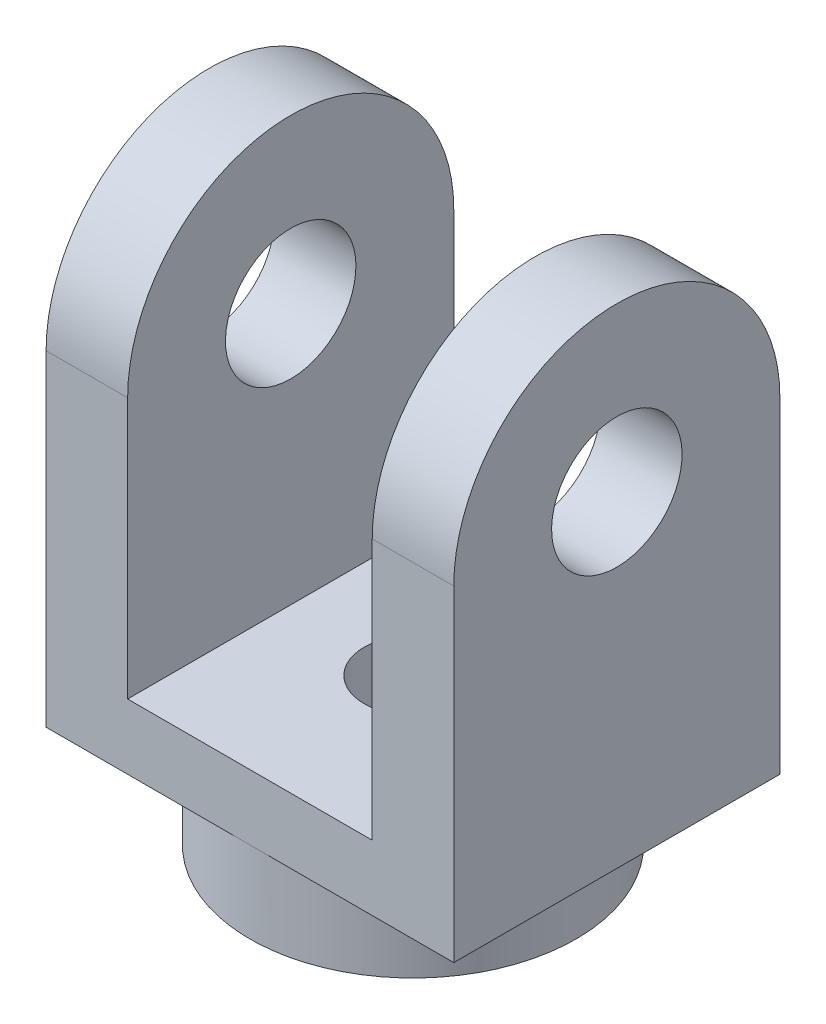
ISO-10303-21;
HEADER;
FILE_DESCRIPTION(('STEP AP214'),'2;1');
FILE_NAME('part.step','',(''),(''),'','','');
FILE_SCHEMA(('AUTOMOTIVE_DESIGN { 1 0 10303 214 1 1 1 1 }'));
ENDSEC;
DATA;
#1=APPLICATION_CONTEXT('core data for automotive mechanical design processes');
#2=APPLICATION_PROTOCOL_DEFINITION('international standard','automotive_design',2000,#1);
#3=PRODUCT_CONTEXT('',#1,'mechanical');
#4=PRODUCT('Part','Part','',(#3));
#5=PRODUCT_RELATED_PRODUCT_CATEGORY('part','',(#4));
#6=PRODUCT_DEFINITION_FORMATION('','',#4);
#7=PRODUCT_DEFINITION_CONTEXT('part definition',#1,'design');
#8=PRODUCT_DEFINITION('design','',#6,#7);
#9=PRODUCT_DEFINITION_SHAPE('','',#8);
#10=(LENGTH_UNIT() NAMED_UNIT(*) SI_UNIT(.MILLI.,.METRE.));
#11=(NAMED_UNIT(*) PLANE_ANGLE_UNIT() SI_UNIT($,.RADIAN.));
#12=(NAMED_UNIT(*) SI_UNIT($,.STERADIAN.) SOLID_ANGLE_UNIT());
#13=UNCERTAINTY_MEASURE_WITH_UNIT(LENGTH_MEASURE(1.E-05),#10,'distance_accuracy_value','');
#14=(GEOMETRIC_REPRESENTATION_CONTEXT(3) GLOBAL_UNCERTAINTY_ASSIGNED_CONTEXT((#13)) GLOBAL_UNIT_ASSIGNED_CONTEXT((#10,
#11,#12)) REPRESENTATION_CONTEXT('',''));
#15=CARTESIAN_POINT('',(0.,0.,0.));
#16=DIRECTION('',(0.,0.,1.));
#17=DIRECTION('',(1.,0.,0.));
#18=AXIS2_PLACEMENT_3D('',#15,#16,#17);
#19=CARTESIAN_POINT('',(-62.5,25.,50.));
#20=DIRECTION('',(0.,1.,0.));
#21=DIRECTION('',(0.,0.,1.));
#22=AXIS2_PLACEMENT_3D('',#19,#20,#21);
#23=PLANE('',#22);
#24=CARTESIAN_POINT('',(0.,25.,0.));
#25=DIRECTION('',(0.,-1.,0.));
#26=DIRECTION('',(0.,0.,-1.));
#27=AXIS2_PLACEMENT_3D('',#24,#25,#26);
#28=CIRCLE('',#27,50.);
#29=CARTESIAN_POINT('',(0.,25.,-50.));
#30=VERTEX_POINT('',#29);
#31=CARTESIAN_POINT('',(0.,25.,50.));
#32=VERTEX_POINT('',#31);
#33=EDGE_CURVE('E46',#30,#32,#28,.T.);
#34=ORIENTED_EDGE('',*,*,#33,.F.);
#35=DIRECTION('',(1.,0.,0.));
#36=VECTOR('',#35,1.);
#37=CARTESIAN_POINT('',(-62.5,25.,-50.));
#38=LINE('',#37,#36);
#39=CARTESIAN_POINT('',(62.5,25.,-50.));
#40=VERTEX_POINT('',#39);
#41=EDGE_CURVE('E145',#30,#40,#38,.T.);
#42=ORIENTED_EDGE('',*,*,#41,.T.);
#43=DIRECTION('',(0.,0.,-1.));
#44=VECTOR('',#43,1.);
#45=CARTESIAN_POINT('',(62.5,25.,50.));
#46=LINE('',#45,#44);
#47=CARTESIAN_POINT('',(62.5,25.,50.));
#48=VERTEX_POINT('',#47);
#49=EDGE_CURVE('E131',#48,#40,#46,.T.);
#50=ORIENTED_EDGE('',*,*,#49,.F.);
#51=DIRECTION('',(1.,0.,0.));
#52=VECTOR('',#51,1.);
#53=CARTESIAN_POINT('',(-62.5,25.,50.));
#54=LINE('',#53,#52);
#55=EDGE_CURVE('E179',#32,#48,#54,.T.);
#56=ORIENTED_EDGE('',*,*,#55,.F.);
#57=EDGE_LOOP('',(#34,#42,#50,#56));
#58=FACE_BOUND('',#57,.T.);
#59=ADVANCED_FACE('F36',(#58),#23,.F.);
#60=CARTESIAN_POINT('',(0.,25.,0.));
#61=DIRECTION('',(0.,1.,0.));
#62=DIRECTION('',(-1.,0.,0.));
#63=AXIS2_PLACEMENT_3D('',#60,#61,#62);
#64=CIRCLE('',#63,15.);
#65=CARTESIAN_POINT('',(-15.,25.,0.));
#66=VERTEX_POINT('',#65);
#67=EDGE_CURVE('E248',#66,#66,#64,.T.);
#68=ORIENTED_EDGE('',*,*,#67,.T.);
#69=EDGE_LOOP('',(#68));
#70=FACE_BOUND('',#69,.T.);
#71=CARTESIAN_POINT('',(0.,25.,0.));
#72=DIRECTION('',(0.,-1.,0.));
#73=DIRECTION('',(0.,0.,-1.));
#74=AXIS2_PLACEMENT_3D('',#71,#72,#73);
#75=CIRCLE('',#74,37.5);
#76=CARTESIAN_POINT('',(0.,25.,-37.5));
#77=VERTEX_POINT('',#76);
#78=EDGE_CURVE('E257',#77,#77,#75,.T.);
#79=ORIENTED_EDGE('',*,*,#78,.T.);
#80=EDGE_LOOP('',(#79));
#81=FACE_BOUND('',#80,.T.);
#82=ADVANCED_FACE('F201',(#70,#81),#23,.F.);
#83=CARTESIAN_POINT('',(-62.5,125.,50.));
#84=DIRECTION('',(1.,0.,0.));
#85=DIRECTION('',(0.,1.,0.));
#86=AXIS2_PLACEMENT_3D('',#83,#84,#85);
#87=PLANE('',#86);
#88=CARTESIAN_POINT('',(-62.5,125.,0.));
#89=DIRECTION('',(-1.,0.,0.));
#90=DIRECTION('',(0.,-1.,0.));
#91=AXIS2_PLACEMENT_3D('',#88,#89,#90);
#92=CIRCLE('',#91,20.);
#93=CARTESIAN_POINT('',(-62.5,105.,0.));
#94=VERTEX_POINT('',#93);
#95=EDGE_CURVE('E219',#94,#94,#92,.T.);
#96=ORIENTED_EDGE('',*,*,#95,.F.);
#97=EDGE_LOOP('',(#96));
#98=FACE_BOUND('',#97,.T.);
#99=DIRECTION('',(0.,-1.,0.));
#100=VECTOR('',#99,1.);
#101=CARTESIAN_POINT('',(-62.5,125.,50.));
#102=LINE('',#101,#100);
#103=CARTESIAN_POINT('',(-62.5,125.,50.));
#104=VERTEX_POINT('',#103);
#105=CARTESIAN_POINT('',(-62.5,25.,50.));
#106=VERTEX_POINT('',#105);
#107=EDGE_CURVE('E97',#104,#106,#102,.T.);
#108=ORIENTED_EDGE('',*,*,#107,.F.);
#109=CARTESIAN_POINT('',(-62.5,125.,0.));
#110=DIRECTION('',(-1.,0.,0.));
#111=DIRECTION('',(0.,-1.,0.));
#112=AXIS2_PLACEMENT_3D('',#109,#110,#111);
#113=CIRCLE('',#112,50.);
#114=CARTESIAN_POINT('',(-62.5,125.,-50.));
#115=VERTEX_POINT('',#114);
#116=EDGE_CURVE('E225',#104,#115,#113,.T.);
#117=ORIENTED_EDGE('',*,*,#116,.T.);
#118=DIRECTION('',(0.,-1.,0.));
#119=VECTOR('',#118,1.);
#120=CARTESIAN_POINT('',(-62.5,125.,-50.));
#121=LINE('',#120,#119);
#122=CARTESIAN_POINT('',(-62.5,25.,-50.));
#123=VERTEX_POINT('',#122);
#124=EDGE_CURVE('E142',#115,#123,#121,.T.);
#125=ORIENTED_EDGE('',*,*,#124,.T.);
#126=DIRECTION('',(0.,0.,-1.));
#127=VECTOR('',#126,1.);
#128=CARTESIAN_POINT('',(-62.5,25.,50.));
#129=LINE('',#128,#127);
#130=EDGE_CURVE('E40',#106,#123,#129,.T.);
#131=ORIENTED_EDGE('',*,*,#130,.F.);
#132=EDGE_LOOP('',(#108,#117,#125,#131));
#133=FACE_BOUND('',#132,.T.);
#134=ADVANCED_FACE('F38',(#98,#133),#87,.F.);
#135=EDGE_CURVE('E11',#32,#30,#28,.T.);
#136=ORIENTED_EDGE('',*,*,#135,.F.);
#137=EDGE_CURVE('E169',#106,#32,#54,.T.);
#138=ORIENTED_EDGE('',*,*,#137,.F.);
#139=ORIENTED_EDGE('',*,*,#130,.T.);
#140=EDGE_CURVE('E146',#123,#30,#38,.T.);
#141=ORIENTED_EDGE('',*,*,#140,.T.);
#142=EDGE_LOOP('',(#136,#138,#139,#141));
#143=FACE_BOUND('',#142,.T.);
#144=ADVANCED_FACE('F165',(#143),#23,.F.);
#145=CARTESIAN_POINT('',(62.5,25.,50.));
#146=DIRECTION('',(-1.,0.,0.));
#147=DIRECTION('',(0.,-1.,0.));
#148=AXIS2_PLACEMENT_3D('',#145,#146,#147);
#149=PLANE('',#148);
#150=CARTESIAN_POINT('',(62.5,125.,0.));
#151=DIRECTION('',(-1.,0.,0.));
#152=DIRECTION('',(0.,-1.,0.));
#153=AXIS2_PLACEMENT_3D('',#150,#151,#152);
#154=CIRCLE('',#153,20.);
#155=CARTESIAN_POINT('',(62.5,105.,0.));
#156=VERTEX_POINT('',#155);
#157=EDGE_CURVE('E244',#156,#156,#154,.T.);
#158=ORIENTED_EDGE('',*,*,#157,.T.);
#159=EDGE_LOOP('',(#158));
#160=FACE_BOUND('',#159,.T.);
#161=DIRECTION('',(0.,1.,0.));
#162=VECTOR('',#161,1.);
#163=CARTESIAN_POINT('',(62.5,25.,-50.));
#164=LINE('',#163,#162);
#165=CARTESIAN_POINT('',(62.5,125.,-50.));
#166=VERTEX_POINT('',#165);
#167=EDGE_CURVE('E148',#40,#166,#164,.T.);
#168=ORIENTED_EDGE('',*,*,#167,.T.);
#169=CARTESIAN_POINT('',(62.5,125.,0.));
#170=DIRECTION('',(-1.,0.,0.));
#171=DIRECTION('',(0.,-1.,0.));
#172=AXIS2_PLACEMENT_3D('',#169,#170,#171);
#173=CIRCLE('',#172,50.);
#174=CARTESIAN_POINT('',(62.5,125.,50.));
#175=VERTEX_POINT('',#174);
#176=EDGE_CURVE('E227',#175,#166,#173,.T.);
#177=ORIENTED_EDGE('',*,*,#176,.F.);
#178=DIRECTION('',(0.,1.,0.));
#179=VECTOR('',#178,1.);
#180=CARTESIAN_POINT('',(62.5,25.,50.));
#181=LINE('',#180,#179);
#182=EDGE_CURVE('E237',#48,#175,#181,.T.);
#183=ORIENTED_EDGE('',*,*,#182,.F.);
#184=ORIENTED_EDGE('',*,*,#49,.T.);
#185=EDGE_LOOP('',(#168,#177,#183,#184));
#186=FACE_BOUND('',#185,.T.);
#187=ADVANCED_FACE('F208',(#160,#186),#149,.F.);
#188=CARTESIAN_POINT('',(37.5,125.,50.));
#189=DIRECTION('',(1.,0.,0.));
#190=DIRECTION('',(0.,1.,0.));
#191=AXIS2_PLACEMENT_3D('',#188,#189,#190);
#192=PLANE('',#191);
#193=CARTESIAN_POINT('',(37.5,125.,0.));
#194=DIRECTION('',(-1.,0.,0.));
#195=DIRECTION('',(0.,-1.,0.));
#196=AXIS2_PLACEMENT_3D('',#193,#194,#195);
#197=CIRCLE('',#196,20.);
#198=CARTESIAN_POINT('',(37.5,105.,0.));
#199=VERTEX_POINT('',#198);
#200=EDGE_CURVE('E242',#199,#199,#197,.T.);
#201=ORIENTED_EDGE('',*,*,#200,.F.);
#202=EDGE_LOOP('',(#201));
#203=FACE_BOUND('',#202,.T.);
#204=DIRECTION('',(0.,-1.,0.));
#205=VECTOR('',#204,1.);
#206=CARTESIAN_POINT('',(37.5,125.,50.));
#207=LINE('',#206,#205);
#208=CARTESIAN_POINT('',(37.5,125.,50.));
#209=VERTEX_POINT('',#208);
#210=CARTESIAN_POINT('',(37.5,45.,50.));
#211=VERTEX_POINT('',#210);
#212=EDGE_CURVE('E112',#209,#211,#207,.T.);
#213=ORIENTED_EDGE('',*,*,#212,.F.);
#214=CARTESIAN_POINT('',(37.5,125.,0.));
#215=DIRECTION('',(-1.,0.,0.));
#216=DIRECTION('',(0.,-1.,0.));
#217=AXIS2_PLACEMENT_3D('',#214,#215,#216);
#218=CIRCLE('',#217,50.);
#219=CARTESIAN_POINT('',(37.5,125.,-50.));
#220=VERTEX_POINT('',#219);
#221=EDGE_CURVE('E222',#209,#220,#218,.T.);
#222=ORIENTED_EDGE('',*,*,#221,.T.);
#223=DIRECTION('',(0.,-1.,0.));
#224=VECTOR('',#223,1.);
#225=CARTESIAN_POINT('',(37.5,125.,-50.));
#226=LINE('',#225,#224);
#227=CARTESIAN_POINT('',(37.5,45.,-50.));
#228=VERTEX_POINT('',#227);
#229=EDGE_CURVE('E128',#220,#228,#226,.T.);
#230=ORIENTED_EDGE('',*,*,#229,.T.);
#231=DIRECTION('',(0.,0.,-1.));
#232=VECTOR('',#231,1.);
#233=CARTESIAN_POINT('',(37.5,45.,50.));
#234=LINE('',#233,#232);
#235=EDGE_CURVE('E125',#211,#228,#234,.T.);
#236=ORIENTED_EDGE('',*,*,#235,.F.);
#237=EDGE_LOOP('',(#213,#222,#230,#236));
#238=FACE_BOUND('',#237,.T.);
#239=ADVANCED_FACE('F126',(#203,#238),#192,.F.);
#240=CARTESIAN_POINT('',(37.5,45.,50.));
#241=DIRECTION('',(0.,-1.,0.));
#242=DIRECTION('',(1.,0.,0.));
#243=AXIS2_PLACEMENT_3D('',#240,#241,#242);
#244=PLANE('',#243);
#245=CARTESIAN_POINT('',(0.,45.,0.));
#246=DIRECTION('',(0.,1.,0.));
#247=DIRECTION('',(-1.,0.,0.));
#248=AXIS2_PLACEMENT_3D('',#245,#246,#247);
#249=CIRCLE('',#248,15.);
#250=CARTESIAN_POINT('',(-15.,45.,0.));
#251=VERTEX_POINT('',#250);
#252=EDGE_CURVE('E250',#251,#251,#249,.T.);
#253=ORIENTED_EDGE('',*,*,#252,.F.);
#254=EDGE_LOOP('',(#253));
#255=FACE_BOUND('',#254,.T.);
#256=DIRECTION('',(-1.,0.,0.));
#257=VECTOR('',#256,1.);
#258=CARTESIAN_POINT('',(37.5,45.,-50.));
#259=LINE('',#258,#257);
#260=CARTESIAN_POINT('',(-37.5,45.,-50.));
#261=VERTEX_POINT('',#260);
#262=EDGE_CURVE('E154',#228,#261,#259,.T.);
#263=ORIENTED_EDGE('',*,*,#262,.T.);
#264=DIRECTION('',(0.,0.,-1.));
#265=VECTOR('',#264,1.);
#266=CARTESIAN_POINT('',(-37.5,45.,50.));
#267=LINE('',#266,#265);
#268=CARTESIAN_POINT('',(-37.5,45.,50.));
#269=VERTEX_POINT('',#268);
#270=EDGE_CURVE('E132',#269,#261,#267,.T.);
#271=ORIENTED_EDGE('',*,*,#270,.F.);
#272=DIRECTION('',(-1.,0.,0.));
#273=VECTOR('',#272,1.);
#274=CARTESIAN_POINT('',(37.5,45.,50.));
#275=LINE('',#274,#273);
#276=EDGE_CURVE('E116',#211,#269,#275,.T.);
#277=ORIENTED_EDGE('',*,*,#276,.F.);
#278=ORIENTED_EDGE('',*,*,#235,.T.);
#279=EDGE_LOOP('',(#263,#271,#277,#278));
#280=FACE_BOUND('',#279,.T.);
#281=ADVANCED_FACE('F134',(#255,#280),#244,.F.);
#282=CARTESIAN_POINT('',(-37.5,45.,50.));
#283=DIRECTION('',(-1.,0.,0.));
#284=DIRECTION('',(0.,0.,1.));
#285=AXIS2_PLACEMENT_3D('',#282,#283,#284);
#286=PLANE('',#285);
#287=CARTESIAN_POINT('',(-37.5,125.,0.));
#288=DIRECTION('',(-1.,0.,0.));
#289=DIRECTION('',(0.,-1.,0.));
#290=AXIS2_PLACEMENT_3D('',#287,#288,#289);
#291=CIRCLE('',#290,20.);
#292=CARTESIAN_POINT('',(-37.5,105.,0.));
#293=VERTEX_POINT('',#292);
#294=EDGE_CURVE('E221',#293,#293,#291,.T.);
#295=ORIENTED_EDGE('',*,*,#294,.T.);
#296=EDGE_LOOP('',(#295));
#297=FACE_BOUND('',#296,.T.);
#298=DIRECTION('',(0.,1.,0.));
#299=VECTOR('',#298,1.);
#300=CARTESIAN_POINT('',(-37.5,45.,-50.));
#301=LINE('',#300,#299);
#302=CARTESIAN_POINT('',(-37.5,125.,-50.));
#303=VERTEX_POINT('',#302);
#304=EDGE_CURVE('E88',#261,#303,#301,.T.);
#305=ORIENTED_EDGE('',*,*,#304,.T.);
#306=CARTESIAN_POINT('',(-37.5,125.,0.));
#307=DIRECTION('',(-1.,0.,0.));
#308=DIRECTION('',(0.,-1.,0.));
#309=AXIS2_PLACEMENT_3D('',#306,#307,#308);
#310=CIRCLE('',#309,50.);
#311=CARTESIAN_POINT('',(-37.5,125.,50.));
#312=VERTEX_POINT('',#311);
#313=EDGE_CURVE('E143',#312,#303,#310,.T.);
#314=ORIENTED_EDGE('',*,*,#313,.F.);
#315=DIRECTION('',(0.,1.,0.));
#316=VECTOR('',#315,1.);
#317=CARTESIAN_POINT('',(-37.5,45.,50.));
#318=LINE('',#317,#316);
#319=EDGE_CURVE('E60',#269,#312,#318,.T.);
#320=ORIENTED_EDGE('',*,*,#319,.F.);
#321=ORIENTED_EDGE('',*,*,#270,.T.);
#322=EDGE_LOOP('',(#305,#314,#320,#321));
#323=FACE_BOUND('',#322,.T.);
#324=ADVANCED_FACE('F274',(#297,#323),#286,.F.);
#325=CARTESIAN_POINT('',(0.,0.,50.));
#326=DIRECTION('',(0.,0.,1.));
#327=DIRECTION('',(1.,0.,0.));
#328=AXIS2_PLACEMENT_3D('',#325,#326,#327);
#329=PLANE('',#328);
#330=DIRECTION('',(-1.,0.,0.));
#331=VECTOR('',#330,1.);
#332=CARTESIAN_POINT('',(-37.5,125.,50.));
#333=LINE('',#332,#331);
#334=EDGE_CURVE('E157',#312,#104,#333,.T.);
#335=ORIENTED_EDGE('',*,*,#334,.T.);
#336=ORIENTED_EDGE('',*,*,#107,.T.);
#337=ORIENTED_EDGE('',*,*,#137,.T.);
#338=ORIENTED_EDGE('',*,*,#55,.T.);
#339=ORIENTED_EDGE('',*,*,#182,.T.);
#340=DIRECTION('',(-1.,0.,0.));
#341=VECTOR('',#340,1.);
#342=CARTESIAN_POINT('',(62.5,125.,50.));
#343=LINE('',#342,#341);
#344=EDGE_CURVE('E119',#175,#209,#343,.T.);
#345=ORIENTED_EDGE('',*,*,#344,.T.);
#346=ORIENTED_EDGE('',*,*,#212,.T.);
#347=ORIENTED_EDGE('',*,*,#276,.T.);
#348=ORIENTED_EDGE('',*,*,#319,.T.);
#349=EDGE_LOOP('',(#335,#336,#337,#338,#339,#345,#346,#347,#348));
#350=FACE_BOUND('',#349,.T.);
#351=ADVANCED_FACE('F114',(#350),#329,.T.);
#352=CARTESIAN_POINT('',(0.,0.,-50.));
#353=DIRECTION('',(0.,0.,1.));
#354=DIRECTION('',(1.,0.,0.));
#355=AXIS2_PLACEMENT_3D('',#352,#353,#354);
#356=PLANE('',#355);
#357=DIRECTION('',(-1.,0.,0.));
#358=VECTOR('',#357,1.);
#359=CARTESIAN_POINT('',(-37.5,125.,-50.));
#360=LINE('',#359,#358);
#361=EDGE_CURVE('E139',#303,#115,#360,.T.);
#362=ORIENTED_EDGE('',*,*,#361,.F.);
#363=ORIENTED_EDGE('',*,*,#304,.F.);
#364=ORIENTED_EDGE('',*,*,#262,.F.);
#365=ORIENTED_EDGE('',*,*,#229,.F.);
#366=DIRECTION('',(-1.,0.,0.));
#367=VECTOR('',#366,1.);
#368=CARTESIAN_POINT('',(62.5,125.,-50.));
#369=LINE('',#368,#367);
#370=EDGE_CURVE('E150',#166,#220,#369,.T.);
#371=ORIENTED_EDGE('',*,*,#370,.F.);
#372=ORIENTED_EDGE('',*,*,#167,.F.);
#373=ORIENTED_EDGE('',*,*,#41,.F.);
#374=ORIENTED_EDGE('',*,*,#140,.F.);
#375=ORIENTED_EDGE('',*,*,#124,.F.);
#376=EDGE_LOOP('',(#362,#363,#364,#365,#371,#372,#373,#374,#375));
#377=FACE_BOUND('',#376,.T.);
#378=ADVANCED_FACE('F172',(#377),#356,.F.);
#379=CARTESIAN_POINT('',(-37.5,125.,0.));
#380=DIRECTION('',(-1.,0.,0.));
#381=DIRECTION('',(0.,-1.,0.));
#382=AXIS2_PLACEMENT_3D('',#379,#380,#381);
#383=CYLINDRICAL_SURFACE('',#382,50.);
#384=ORIENTED_EDGE('',*,*,#334,.F.);
#385=ORIENTED_EDGE('',*,*,#313,.T.);
#386=ORIENTED_EDGE('',*,*,#361,.T.);
#387=ORIENTED_EDGE('',*,*,#116,.F.);
#388=EDGE_LOOP('',(#384,#385,#386,#387));
#389=FACE_BOUND('',#388,.T.);
#390=ADVANCED_FACE('F287',(#389),#383,.T.);
#391=CARTESIAN_POINT('',(-37.5,125.,0.));
#392=DIRECTION('',(-1.,0.,0.));
#393=DIRECTION('',(0.,-1.,0.));
#394=AXIS2_PLACEMENT_3D('',#391,#392,#393);
#395=CYLINDRICAL_SURFACE('',#394,20.);
#396=ORIENTED_EDGE('',*,*,#294,.F.);
#397=EDGE_LOOP('',(#396));
#398=FACE_BOUND('',#397,.T.);
#399=ORIENTED_EDGE('',*,*,#95,.T.);
#400=EDGE_LOOP('',(#399));
#401=FACE_BOUND('',#400,.T.);
#402=ADVANCED_FACE('F292',(#398,#401),#395,.F.);
#403=CARTESIAN_POINT('',(37.5,125.,0.));
#404=DIRECTION('',(1.,0.,0.));
#405=DIRECTION('',(0.,1.,0.));
#406=AXIS2_PLACEMENT_3D('',#403,#404,#405);
#407=CYLINDRICAL_SURFACE('',#406,50.);
#408=ORIENTED_EDGE('',*,*,#344,.F.);
#409=ORIENTED_EDGE('',*,*,#176,.T.);
#410=ORIENTED_EDGE('',*,*,#370,.T.);
#411=ORIENTED_EDGE('',*,*,#221,.F.);
#412=EDGE_LOOP('',(#408,#409,#410,#411));
#413=FACE_BOUND('',#412,.T.);
#414=ADVANCED_FACE('F241',(#413),#407,.T.);
#415=CARTESIAN_POINT('',(37.5,125.,0.));
#416=DIRECTION('',(1.,0.,0.));
#417=DIRECTION('',(0.,1.,0.));
#418=AXIS2_PLACEMENT_3D('',#415,#416,#417);
#419=CYLINDRICAL_SURFACE('',#418,20.);
#420=ORIENTED_EDGE('',*,*,#200,.T.);
#421=EDGE_LOOP('',(#420));
#422=FACE_BOUND('',#421,.T.);
#423=ORIENTED_EDGE('',*,*,#157,.F.);
#424=EDGE_LOOP('',(#423));
#425=FACE_BOUND('',#424,.T.);
#426=ADVANCED_FACE('F270',(#422,#425),#419,.F.);
#427=CARTESIAN_POINT('',(0.,25.,0.));
#428=DIRECTION('',(0.,1.,0.));
#429=DIRECTION('',(-1.,0.,0.));
#430=AXIS2_PLACEMENT_3D('',#427,#428,#429);
#431=CYLINDRICAL_SURFACE('',#430,15.);
#432=ORIENTED_EDGE('',*,*,#67,.F.);
#433=EDGE_LOOP('',(#432));
#434=FACE_BOUND('',#433,.T.);
#435=ORIENTED_EDGE('',*,*,#252,.T.);
#436=EDGE_LOOP('',(#435));
#437=FACE_BOUND('',#436,.T.);
#438=ADVANCED_FACE('F195',(#434,#437),#431,.F.);
#439=CARTESIAN_POINT('',(0.,0.,0.));
#440=DIRECTION('',(0.,-1.,0.));
#441=DIRECTION('',(0.,0.,-1.));
#442=AXIS2_PLACEMENT_3D('',#439,#440,#441);
#443=PLANE('',#442);
#444=CARTESIAN_POINT('',(0.,0.,0.));
#445=DIRECTION('',(0.,-1.,0.));
#446=DIRECTION('',(0.,0.,-1.));
#447=AXIS2_PLACEMENT_3D('',#444,#445,#446);
#448=CIRCLE('',#447,50.);
#449=CARTESIAN_POINT('',(0.,0.,-50.));
#450=VERTEX_POINT('',#449);
#451=EDGE_CURVE('E181',#450,#450,#448,.T.);
#452=ORIENTED_EDGE('',*,*,#451,.T.);
#453=EDGE_LOOP('',(#452));
#454=FACE_BOUND('',#453,.T.);
#455=CARTESIAN_POINT('',(0.,0.,0.));
#456=DIRECTION('',(0.,-1.,0.));
#457=DIRECTION('',(0.,0.,-1.));
#458=AXIS2_PLACEMENT_3D('',#455,#456,#457);
#459=CIRCLE('',#458,37.5);
#460=CARTESIAN_POINT('',(0.,0.,-37.5));
#461=VERTEX_POINT('',#460);
#462=EDGE_CURVE('E182',#461,#461,#459,.T.);
#463=ORIENTED_EDGE('',*,*,#462,.F.);
#464=EDGE_LOOP('',(#463));
#465=FACE_BOUND('',#464,.T.);
#466=ADVANCED_FACE('F186',(#454,#465),#443,.T.);
#467=CARTESIAN_POINT('',(0.,0.,0.));
#468=DIRECTION('',(0.,1.,0.));
#469=DIRECTION('',(0.,0.,1.));
#470=AXIS2_PLACEMENT_3D('',#467,#468,#469);
#471=CYLINDRICAL_SURFACE('',#470,50.);
#472=ORIENTED_EDGE('',*,*,#451,.F.);
#473=EDGE_LOOP('',(#472));
#474=FACE_BOUND('',#473,.T.);
#475=ORIENTED_EDGE('',*,*,#33,.T.);
#476=ORIENTED_EDGE('',*,*,#135,.T.);
#477=EDGE_LOOP('',(#475,#476));
#478=FACE_BOUND('',#477,.T.);
#479=ADVANCED_FACE('F183',(#474,#478),#471,.T.);
#480=CARTESIAN_POINT('',(0.,0.,0.));
#481=DIRECTION('',(0.,1.,0.));
#482=DIRECTION('',(0.,0.,1.));
#483=AXIS2_PLACEMENT_3D('',#480,#481,#482);
#484=CYLINDRICAL_SURFACE('',#483,37.5);
#485=ORIENTED_EDGE('',*,*,#462,.T.);
#486=EDGE_LOOP('',(#485));
#487=FACE_BOUND('',#486,.T.);
#488=ORIENTED_EDGE('',*,*,#78,.F.);
#489=EDGE_LOOP('',(#488));
#490=FACE_BOUND('',#489,.T.);
#491=ADVANCED_FACE('F185',(#487,#490),#484,.F.);
#492=CLOSED_SHELL('',(#59,#82,#134,#144,#187,#239,#281,#324,#351,#378,#390,#402,#414,#426,#438,
#466,#479,#491));
#493=MANIFOLD_SOLID_BREP('B2',#492);
#494=ADVANCED_BREP_SHAPE_REPRESENTATION('',(#18,#493),#14);
#495=SHAPE_DEFINITION_REPRESENTATION(#9,#494);
ENDSEC;
END-ISO-10303-21;
